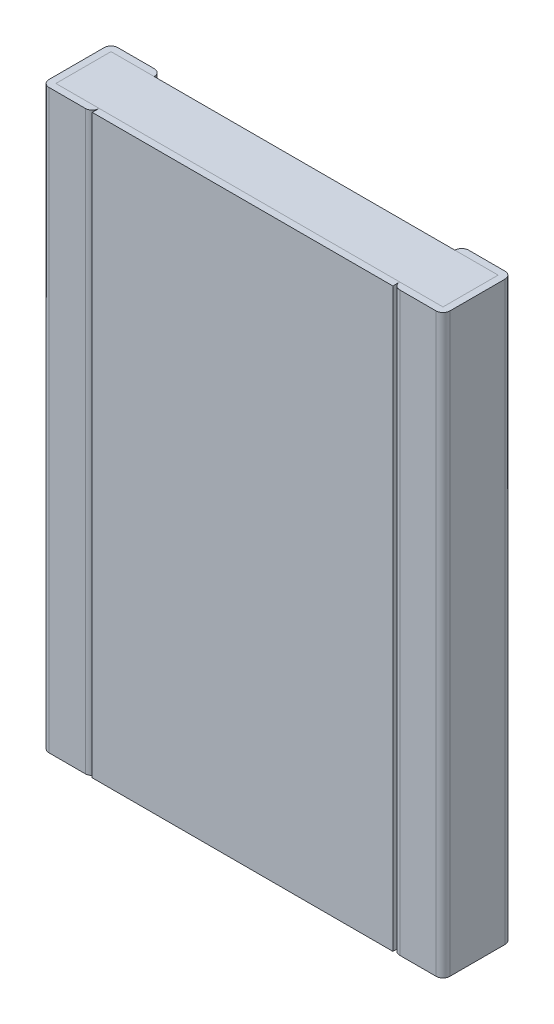
ISO-10303-21;
HEADER;
FILE_DESCRIPTION(('STEP AP214'),'2;1');
FILE_NAME('part.step','',(''),(''),'','','');
FILE_SCHEMA(('AUTOMOTIVE_DESIGN { 1 0 10303 214 1 1 1 1 }'));
ENDSEC;
DATA;
#1=APPLICATION_CONTEXT('core data for automotive mechanical design processes');
#2=APPLICATION_PROTOCOL_DEFINITION('international standard','automotive_design',2000,#1);
#3=PRODUCT_CONTEXT('',#1,'mechanical');
#4=PRODUCT('Part','Part','',(#3));
#5=PRODUCT_RELATED_PRODUCT_CATEGORY('part','',(#4));
#6=PRODUCT_DEFINITION_FORMATION('','',#4);
#7=PRODUCT_DEFINITION_CONTEXT('part definition',#1,'design');
#8=PRODUCT_DEFINITION('design','',#6,#7);
#9=PRODUCT_DEFINITION_SHAPE('','',#8);
#10=(LENGTH_UNIT() NAMED_UNIT(*) SI_UNIT(.MILLI.,.METRE.));
#11=(NAMED_UNIT(*) PLANE_ANGLE_UNIT() SI_UNIT($,.RADIAN.));
#12=(NAMED_UNIT(*) SI_UNIT($,.STERADIAN.) SOLID_ANGLE_UNIT());
#13=UNCERTAINTY_MEASURE_WITH_UNIT(LENGTH_MEASURE(1.E-05),#10,'distance_accuracy_value','');
#14=(GEOMETRIC_REPRESENTATION_CONTEXT(3) GLOBAL_UNCERTAINTY_ASSIGNED_CONTEXT((#13)) GLOBAL_UNIT_ASSIGNED_CONTEXT((#10,
#11,#12)) REPRESENTATION_CONTEXT('',''));
#15=CARTESIAN_POINT('',(0.,0.,0.));
#16=DIRECTION('',(0.,0.,1.));
#17=DIRECTION('',(1.,0.,0.));
#18=AXIS2_PLACEMENT_3D('',#15,#16,#17);
#19=CARTESIAN_POINT('',(-1.6,-2.3,0.));
#20=DIRECTION('',(1.,0.,0.));
#21=DIRECTION('',(0.,0.,1.));
#22=AXIS2_PLACEMENT_3D('',#19,#20,#21);
#23=PLANE('',#22);
#24=DIRECTION('',(0.,1.,0.));
#25=VECTOR('',#24,1.);
#26=CARTESIAN_POINT('',(-1.6,-2.3,0.495));
#27=LINE('',#26,#25);
#28=CARTESIAN_POINT('',(-1.6,-2.3,0.495));
#29=VERTEX_POINT('',#28);
#30=CARTESIAN_POINT('',(-1.6,2.3,0.495));
#31=VERTEX_POINT('',#30);
#32=EDGE_CURVE('E11',#29,#31,#27,.T.);
#33=ORIENTED_EDGE('',*,*,#32,.T.);
#34=DIRECTION('',(0.,0.,1.));
#35=VECTOR('',#34,1.);
#36=CARTESIAN_POINT('',(-1.6,2.3,0.));
#37=LINE('',#36,#35);
#38=CARTESIAN_POINT('',(-1.6,2.3,0.055));
#39=VERTEX_POINT('',#38);
#40=EDGE_CURVE('E24',#39,#31,#37,.T.);
#41=ORIENTED_EDGE('',*,*,#40,.F.);
#42=DIRECTION('',(0.,1.,0.));
#43=VECTOR('',#42,1.);
#44=CARTESIAN_POINT('',(-1.6,-2.3,0.055));
#45=LINE('',#44,#43);
#46=CARTESIAN_POINT('',(-1.6,-2.3,0.055));
#47=VERTEX_POINT('',#46);
#48=EDGE_CURVE('E347',#47,#39,#45,.T.);
#49=ORIENTED_EDGE('',*,*,#48,.F.);
#50=DIRECTION('',(0.,0.,1.));
#51=VECTOR('',#50,1.);
#52=CARTESIAN_POINT('',(-1.6,-2.3,0.));
#53=LINE('',#52,#51);
#54=EDGE_CURVE('E36',#47,#29,#53,.T.);
#55=ORIENTED_EDGE('',*,*,#54,.T.);
#56=EDGE_LOOP('',(#33,#41,#49,#55));
#57=FACE_BOUND('',#56,.T.);
#58=ADVANCED_FACE('F17',(#57),#23,.F.);
#59=CARTESIAN_POINT('',(-1.6,-2.3,0.));
#60=DIRECTION('',(0.,1.,0.));
#61=DIRECTION('',(0.,0.,1.));
#62=AXIS2_PLACEMENT_3D('',#59,#60,#61);
#63=PLANE('',#62);
#64=CARTESIAN_POINT('',(-1.255,-2.3,0.055));
#65=DIRECTION('',(0.,1.,0.));
#66=DIRECTION('',(0.,0.,1.));
#67=AXIS2_PLACEMENT_3D('',#64,#65,#66);
#68=CIRCLE('',#67,0.055);
#69=CARTESIAN_POINT('',(-1.2,-2.3,0.055));
#70=VERTEX_POINT('',#69);
#71=CARTESIAN_POINT('',(-1.255,-2.3,0.));
#72=VERTEX_POINT('',#71);
#73=EDGE_CURVE('E343',#70,#72,#68,.T.);
#74=ORIENTED_EDGE('',*,*,#73,.F.);
#75=DIRECTION('',(1.,0.,0.));
#76=VECTOR('',#75,1.);
#77=CARTESIAN_POINT('',(-1.545,-2.3,0.055));
#78=LINE('',#77,#76);
#79=CARTESIAN_POINT('',(-1.545,-2.3,0.055));
#80=VERTEX_POINT('',#79);
#81=EDGE_CURVE('E341',#80,#70,#78,.T.);
#82=ORIENTED_EDGE('',*,*,#81,.F.);
#83=DIRECTION('',(0.,0.,1.));
#84=VECTOR('',#83,1.);
#85=CARTESIAN_POINT('',(-1.545,-2.3,0.055));
#86=LINE('',#85,#84);
#87=CARTESIAN_POINT('',(-1.545,-2.3,0.495));
#88=VERTEX_POINT('',#87);
#89=EDGE_CURVE('E338',#80,#88,#86,.T.);
#90=ORIENTED_EDGE('',*,*,#89,.T.);
#91=DIRECTION('',(1.,0.,0.));
#92=VECTOR('',#91,1.);
#93=CARTESIAN_POINT('',(-1.545,-2.3,0.495));
#94=LINE('',#93,#92);
#95=CARTESIAN_POINT('',(-1.2,-2.3,0.495));
#96=VERTEX_POINT('',#95);
#97=EDGE_CURVE('E335',#88,#96,#94,.T.);
#98=ORIENTED_EDGE('',*,*,#97,.T.);
#99=CARTESIAN_POINT('',(-1.255,-2.3,0.495));
#100=DIRECTION('',(0.,-1.,0.));
#101=DIRECTION('',(0.,0.,1.));
#102=AXIS2_PLACEMENT_3D('',#99,#100,#101);
#103=CIRCLE('',#102,0.055);
#104=CARTESIAN_POINT('',(-1.255,-2.3,0.55));
#105=VERTEX_POINT('',#104);
#106=EDGE_CURVE('E332',#96,#105,#103,.T.);
#107=ORIENTED_EDGE('',*,*,#106,.T.);
#108=DIRECTION('',(1.,0.,0.));
#109=VECTOR('',#108,1.);
#110=CARTESIAN_POINT('',(-1.6,-2.3,0.55));
#111=LINE('',#110,#109);
#112=CARTESIAN_POINT('',(-1.545,-2.3,0.55));
#113=VERTEX_POINT('',#112);
#114=EDGE_CURVE('E330',#113,#105,#111,.T.);
#115=ORIENTED_EDGE('',*,*,#114,.F.);
#116=CARTESIAN_POINT('',(-1.545,-2.3,0.495));
#117=DIRECTION('',(0.,1.,0.));
#118=DIRECTION('',(0.,0.,1.));
#119=AXIS2_PLACEMENT_3D('',#116,#117,#118);
#120=CIRCLE('',#119,0.055);
#121=EDGE_CURVE('E328',#29,#113,#120,.T.);
#122=ORIENTED_EDGE('',*,*,#121,.F.);
#123=ORIENTED_EDGE('',*,*,#54,.F.);
#124=CARTESIAN_POINT('',(-1.545,-2.3,0.055));
#125=DIRECTION('',(0.,-1.,0.));
#126=DIRECTION('',(0.,0.,1.));
#127=AXIS2_PLACEMENT_3D('',#124,#125,#126);
#128=CIRCLE('',#127,0.055);
#129=CARTESIAN_POINT('',(-1.545,-2.3,0.));
#130=VERTEX_POINT('',#129);
#131=EDGE_CURVE('E325',#47,#130,#128,.T.);
#132=ORIENTED_EDGE('',*,*,#131,.T.);
#133=DIRECTION('',(1.,0.,0.));
#134=VECTOR('',#133,1.);
#135=CARTESIAN_POINT('',(-1.6,-2.3,0.));
#136=LINE('',#135,#134);
#137=EDGE_CURVE('E323',#130,#72,#136,.T.);
#138=ORIENTED_EDGE('',*,*,#137,.T.);
#139=EDGE_LOOP('',(#74,#82,#90,#98,#107,#115,#122,#123,#132,#138));
#140=FACE_BOUND('',#139,.T.);
#141=ADVANCED_FACE('F361',(#140),#63,.F.);
#142=CARTESIAN_POINT('',(-1.545,-2.3,0.055));
#143=DIRECTION('',(0.,1.,0.));
#144=DIRECTION('',(-1.,0.,0.));
#145=AXIS2_PLACEMENT_3D('',#142,#143,#144);
#146=CYLINDRICAL_SURFACE('',#145,0.055);
#147=ORIENTED_EDGE('',*,*,#48,.T.);
#148=CARTESIAN_POINT('',(-1.545,2.3,0.055));
#149=DIRECTION('',(0.,-1.,0.));
#150=DIRECTION('',(0.,0.,1.));
#151=AXIS2_PLACEMENT_3D('',#148,#149,#150);
#152=CIRCLE('',#151,0.055);
#153=CARTESIAN_POINT('',(-1.545,2.3,0.));
#154=VERTEX_POINT('',#153);
#155=EDGE_CURVE('E321',#39,#154,#152,.T.);
#156=ORIENTED_EDGE('',*,*,#155,.T.);
#157=DIRECTION('',(0.,1.,0.));
#158=VECTOR('',#157,1.);
#159=CARTESIAN_POINT('',(-1.545,-2.3,0.));
#160=LINE('',#159,#158);
#161=EDGE_CURVE('E318',#130,#154,#160,.T.);
#162=ORIENTED_EDGE('',*,*,#161,.F.);
#163=ORIENTED_EDGE('',*,*,#131,.F.);
#164=EDGE_LOOP('',(#147,#156,#162,#163));
#165=FACE_BOUND('',#164,.T.);
#166=ADVANCED_FACE('F350',(#165),#146,.T.);
#167=CARTESIAN_POINT('',(-1.545,-2.3,0.495));
#168=DIRECTION('',(0.,1.,0.));
#169=DIRECTION('',(-1.,0.,0.));
#170=AXIS2_PLACEMENT_3D('',#167,#168,#169);
#171=CYLINDRICAL_SURFACE('',#170,0.055);
#172=ORIENTED_EDGE('',*,*,#121,.T.);
#173=DIRECTION('',(0.,1.,0.));
#174=VECTOR('',#173,1.);
#175=CARTESIAN_POINT('',(-1.545,-2.3,0.55));
#176=LINE('',#175,#174);
#177=CARTESIAN_POINT('',(-1.545,2.3,0.55));
#178=VERTEX_POINT('',#177);
#179=EDGE_CURVE('E316',#113,#178,#176,.T.);
#180=ORIENTED_EDGE('',*,*,#179,.T.);
#181=CARTESIAN_POINT('',(-1.545,2.3,0.495));
#182=DIRECTION('',(0.,1.,0.));
#183=DIRECTION('',(0.,0.,1.));
#184=AXIS2_PLACEMENT_3D('',#181,#182,#183);
#185=CIRCLE('',#184,0.055);
#186=EDGE_CURVE('E314',#31,#178,#185,.T.);
#187=ORIENTED_EDGE('',*,*,#186,.F.);
#188=ORIENTED_EDGE('',*,*,#32,.F.);
#189=EDGE_LOOP('',(#172,#180,#187,#188));
#190=FACE_BOUND('',#189,.T.);
#191=ADVANCED_FACE('F366',(#190),#171,.T.);
#192=CARTESIAN_POINT('',(-1.6,2.3,0.));
#193=DIRECTION('',(0.,1.,0.));
#194=DIRECTION('',(0.,0.,1.));
#195=AXIS2_PLACEMENT_3D('',#192,#193,#194);
#196=PLANE('',#195);
#197=DIRECTION('',(1.,0.,0.));
#198=VECTOR('',#197,1.);
#199=CARTESIAN_POINT('',(-1.6,2.3,0.));
#200=LINE('',#199,#198);
#201=CARTESIAN_POINT('',(-1.255,2.3,0.));
#202=VERTEX_POINT('',#201);
#203=EDGE_CURVE('E312',#154,#202,#200,.T.);
#204=ORIENTED_EDGE('',*,*,#203,.F.);
#205=ORIENTED_EDGE('',*,*,#155,.F.);
#206=ORIENTED_EDGE('',*,*,#40,.T.);
#207=ORIENTED_EDGE('',*,*,#186,.T.);
#208=DIRECTION('',(1.,0.,0.));
#209=VECTOR('',#208,1.);
#210=CARTESIAN_POINT('',(-1.6,2.3,0.55));
#211=LINE('',#210,#209);
#212=CARTESIAN_POINT('',(-1.255,2.3,0.55));
#213=VERTEX_POINT('',#212);
#214=EDGE_CURVE('E310',#178,#213,#211,.T.);
#215=ORIENTED_EDGE('',*,*,#214,.T.);
#216=CARTESIAN_POINT('',(-1.255,2.3,0.495));
#217=DIRECTION('',(0.,-1.,0.));
#218=DIRECTION('',(0.,0.,1.));
#219=AXIS2_PLACEMENT_3D('',#216,#217,#218);
#220=CIRCLE('',#219,0.055);
#221=CARTESIAN_POINT('',(-1.2,2.3,0.495));
#222=VERTEX_POINT('',#221);
#223=EDGE_CURVE('E307',#222,#213,#220,.T.);
#224=ORIENTED_EDGE('',*,*,#223,.F.);
#225=DIRECTION('',(1.,0.,0.));
#226=VECTOR('',#225,1.);
#227=CARTESIAN_POINT('',(-1.545,2.3,0.495));
#228=LINE('',#227,#226);
#229=CARTESIAN_POINT('',(-1.545,2.3,0.495));
#230=VERTEX_POINT('',#229);
#231=EDGE_CURVE('E304',#230,#222,#228,.T.);
#232=ORIENTED_EDGE('',*,*,#231,.F.);
#233=DIRECTION('',(0.,0.,1.));
#234=VECTOR('',#233,1.);
#235=CARTESIAN_POINT('',(-1.545,2.3,0.055));
#236=LINE('',#235,#234);
#237=CARTESIAN_POINT('',(-1.545,2.3,0.055));
#238=VERTEX_POINT('',#237);
#239=EDGE_CURVE('E301',#238,#230,#236,.T.);
#240=ORIENTED_EDGE('',*,*,#239,.F.);
#241=DIRECTION('',(1.,0.,0.));
#242=VECTOR('',#241,1.);
#243=CARTESIAN_POINT('',(-1.545,2.3,0.055));
#244=LINE('',#243,#242);
#245=CARTESIAN_POINT('',(-1.2,2.3,0.055));
#246=VERTEX_POINT('',#245);
#247=EDGE_CURVE('E299',#238,#246,#244,.T.);
#248=ORIENTED_EDGE('',*,*,#247,.T.);
#249=CARTESIAN_POINT('',(-1.255,2.3,0.055));
#250=DIRECTION('',(0.,1.,0.));
#251=DIRECTION('',(0.,0.,1.));
#252=AXIS2_PLACEMENT_3D('',#249,#250,#251);
#253=CIRCLE('',#252,0.055);
#254=EDGE_CURVE('E296',#246,#202,#253,.T.);
#255=ORIENTED_EDGE('',*,*,#254,.T.);
#256=EDGE_LOOP('',(#204,#205,#206,#207,#215,#224,#232,#240,#248,#255));
#257=FACE_BOUND('',#256,.T.);
#258=ADVANCED_FACE('F354',(#257),#196,.T.);
#259=CARTESIAN_POINT('',(-1.6,-2.3,0.));
#260=DIRECTION('',(0.,0.,1.));
#261=DIRECTION('',(1.,0.,0.));
#262=AXIS2_PLACEMENT_3D('',#259,#260,#261);
#263=PLANE('',#262);
#264=DIRECTION('',(0.,1.,0.));
#265=VECTOR('',#264,1.);
#266=CARTESIAN_POINT('',(-1.255,-2.3,0.));
#267=LINE('',#266,#265);
#268=EDGE_CURVE('E293',#72,#202,#267,.T.);
#269=ORIENTED_EDGE('',*,*,#268,.F.);
#270=ORIENTED_EDGE('',*,*,#137,.F.);
#271=ORIENTED_EDGE('',*,*,#161,.T.);
#272=ORIENTED_EDGE('',*,*,#203,.T.);
#273=EDGE_LOOP('',(#269,#270,#271,#272));
#274=FACE_BOUND('',#273,.T.);
#275=ADVANCED_FACE('F358',(#274),#263,.F.);
#276=CARTESIAN_POINT('',(-1.255,-2.3,0.055));
#277=DIRECTION('',(0.,1.,0.));
#278=DIRECTION('',(1.,0.,0.));
#279=AXIS2_PLACEMENT_3D('',#276,#277,#278);
#280=CYLINDRICAL_SURFACE('',#279,0.055);
#281=ORIENTED_EDGE('',*,*,#73,.T.);
#282=ORIENTED_EDGE('',*,*,#268,.T.);
#283=ORIENTED_EDGE('',*,*,#254,.F.);
#284=DIRECTION('',(0.,1.,0.));
#285=VECTOR('',#284,1.);
#286=CARTESIAN_POINT('',(-1.2,-2.3,0.055));
#287=LINE('',#286,#285);
#288=EDGE_CURVE('E290',#70,#246,#287,.T.);
#289=ORIENTED_EDGE('',*,*,#288,.F.);
#290=EDGE_LOOP('',(#281,#282,#283,#289));
#291=FACE_BOUND('',#290,.T.);
#292=ADVANCED_FACE('F381',(#291),#280,.T.);
#293=CARTESIAN_POINT('',(-1.545,-2.3,0.055));
#294=DIRECTION('',(0.,1.,0.));
#295=DIRECTION('',(0.,0.,1.));
#296=AXIS2_PLACEMENT_3D('',#293,#294,#295);
#297=PLANE('',#296);
#298=DIRECTION('',(1.,0.,0.));
#299=VECTOR('',#298,1.);
#300=CARTESIAN_POINT('',(-1.545,-2.3,0.055));
#301=LINE('',#300,#299);
#302=CARTESIAN_POINT('',(1.2,-2.3,0.055));
#303=VERTEX_POINT('',#302);
#304=EDGE_CURVE('E287',#70,#303,#301,.T.);
#305=ORIENTED_EDGE('',*,*,#304,.T.);
#306=DIRECTION('',(1.,0.,0.));
#307=VECTOR('',#306,1.);
#308=CARTESIAN_POINT('',(-1.545,-2.3,0.055));
#309=LINE('',#308,#307);
#310=CARTESIAN_POINT('',(1.545,-2.3,0.055));
#311=VERTEX_POINT('',#310);
#312=EDGE_CURVE('E284',#303,#311,#309,.T.);
#313=ORIENTED_EDGE('',*,*,#312,.T.);
#314=DIRECTION('',(0.,0.,1.));
#315=VECTOR('',#314,1.);
#316=CARTESIAN_POINT('',(1.545,-2.3,0.055));
#317=LINE('',#316,#315);
#318=CARTESIAN_POINT('',(1.545,-2.3,0.495));
#319=VERTEX_POINT('',#318);
#320=EDGE_CURVE('E281',#311,#319,#317,.T.);
#321=ORIENTED_EDGE('',*,*,#320,.T.);
#322=DIRECTION('',(1.,0.,0.));
#323=VECTOR('',#322,1.);
#324=CARTESIAN_POINT('',(-1.545,-2.3,0.495));
#325=LINE('',#324,#323);
#326=CARTESIAN_POINT('',(1.2,-2.3,0.495));
#327=VERTEX_POINT('',#326);
#328=EDGE_CURVE('E279',#327,#319,#325,.T.);
#329=ORIENTED_EDGE('',*,*,#328,.F.);
#330=DIRECTION('',(1.,0.,0.));
#331=VECTOR('',#330,1.);
#332=CARTESIAN_POINT('',(-1.2,-2.3,0.495));
#333=LINE('',#332,#331);
#334=EDGE_CURVE('E277',#96,#327,#333,.T.);
#335=ORIENTED_EDGE('',*,*,#334,.F.);
#336=ORIENTED_EDGE('',*,*,#97,.F.);
#337=ORIENTED_EDGE('',*,*,#89,.F.);
#338=ORIENTED_EDGE('',*,*,#81,.T.);
#339=EDGE_LOOP('',(#305,#313,#321,#329,#335,#336,#337,#338));
#340=FACE_BOUND('',#339,.T.);
#341=ADVANCED_FACE('F400',(#340),#297,.F.);
#342=CARTESIAN_POINT('',(-1.6,-2.3,0.55));
#343=DIRECTION('',(0.,0.,1.));
#344=DIRECTION('',(1.,0.,0.));
#345=AXIS2_PLACEMENT_3D('',#342,#343,#344);
#346=PLANE('',#345);
#347=ORIENTED_EDGE('',*,*,#214,.F.);
#348=ORIENTED_EDGE('',*,*,#179,.F.);
#349=ORIENTED_EDGE('',*,*,#114,.T.);
#350=DIRECTION('',(0.,1.,0.));
#351=VECTOR('',#350,1.);
#352=CARTESIAN_POINT('',(-1.255,-2.3,0.55));
#353=LINE('',#352,#351);
#354=EDGE_CURVE('E274',#105,#213,#353,.T.);
#355=ORIENTED_EDGE('',*,*,#354,.T.);
#356=EDGE_LOOP('',(#347,#348,#349,#355));
#357=FACE_BOUND('',#356,.T.);
#358=ADVANCED_FACE('F369',(#357),#346,.T.);
#359=CARTESIAN_POINT('',(-1.255,-2.3,0.495));
#360=DIRECTION('',(0.,1.,0.));
#361=DIRECTION('',(1.,0.,0.));
#362=AXIS2_PLACEMENT_3D('',#359,#360,#361);
#363=CYLINDRICAL_SURFACE('',#362,0.055);
#364=DIRECTION('',(0.,1.,0.));
#365=VECTOR('',#364,1.);
#366=CARTESIAN_POINT('',(-1.2,-2.3,0.495));
#367=LINE('',#366,#365);
#368=EDGE_CURVE('E271',#96,#222,#367,.T.);
#369=ORIENTED_EDGE('',*,*,#368,.T.);
#370=ORIENTED_EDGE('',*,*,#223,.T.);
#371=ORIENTED_EDGE('',*,*,#354,.F.);
#372=ORIENTED_EDGE('',*,*,#106,.F.);
#373=EDGE_LOOP('',(#369,#370,#371,#372));
#374=FACE_BOUND('',#373,.T.);
#375=ADVANCED_FACE('F372',(#374),#363,.T.);
#376=CARTESIAN_POINT('',(-1.545,2.3,0.055));
#377=DIRECTION('',(0.,1.,0.));
#378=DIRECTION('',(0.,0.,1.));
#379=AXIS2_PLACEMENT_3D('',#376,#377,#378);
#380=PLANE('',#379);
#381=ORIENTED_EDGE('',*,*,#247,.F.);
#382=ORIENTED_EDGE('',*,*,#239,.T.);
#383=ORIENTED_EDGE('',*,*,#231,.T.);
#384=DIRECTION('',(1.,0.,0.));
#385=VECTOR('',#384,1.);
#386=CARTESIAN_POINT('',(-1.2,2.3,0.495));
#387=LINE('',#386,#385);
#388=CARTESIAN_POINT('',(1.2,2.3,0.495));
#389=VERTEX_POINT('',#388);
#390=EDGE_CURVE('E269',#222,#389,#387,.T.);
#391=ORIENTED_EDGE('',*,*,#390,.T.);
#392=DIRECTION('',(1.,0.,0.));
#393=VECTOR('',#392,1.);
#394=CARTESIAN_POINT('',(-1.545,2.3,0.495));
#395=LINE('',#394,#393);
#396=CARTESIAN_POINT('',(1.545,2.3,0.495));
#397=VERTEX_POINT('',#396);
#398=EDGE_CURVE('E267',#389,#397,#395,.T.);
#399=ORIENTED_EDGE('',*,*,#398,.T.);
#400=DIRECTION('',(0.,0.,1.));
#401=VECTOR('',#400,1.);
#402=CARTESIAN_POINT('',(1.545,2.3,0.055));
#403=LINE('',#402,#401);
#404=CARTESIAN_POINT('',(1.545,2.3,0.055));
#405=VERTEX_POINT('',#404);
#406=EDGE_CURVE('E264',#405,#397,#403,.T.);
#407=ORIENTED_EDGE('',*,*,#406,.F.);
#408=DIRECTION('',(1.,0.,0.));
#409=VECTOR('',#408,1.);
#410=CARTESIAN_POINT('',(-1.545,2.3,0.055));
#411=LINE('',#410,#409);
#412=CARTESIAN_POINT('',(1.2,2.3,0.055));
#413=VERTEX_POINT('',#412);
#414=EDGE_CURVE('E261',#413,#405,#411,.T.);
#415=ORIENTED_EDGE('',*,*,#414,.F.);
#416=DIRECTION('',(1.,0.,0.));
#417=VECTOR('',#416,1.);
#418=CARTESIAN_POINT('',(-1.545,2.3,0.055));
#419=LINE('',#418,#417);
#420=EDGE_CURVE('E258',#246,#413,#419,.T.);
#421=ORIENTED_EDGE('',*,*,#420,.F.);
#422=EDGE_LOOP('',(#381,#382,#383,#391,#399,#407,#415,#421));
#423=FACE_BOUND('',#422,.T.);
#424=ADVANCED_FACE('F376',(#423),#380,.T.);
#425=CARTESIAN_POINT('',(-1.545,-2.3,0.055));
#426=DIRECTION('',(0.,0.,1.));
#427=DIRECTION('',(1.,0.,0.));
#428=AXIS2_PLACEMENT_3D('',#425,#426,#427);
#429=PLANE('',#428);
#430=ORIENTED_EDGE('',*,*,#420,.T.);
#431=DIRECTION('',(0.,1.,0.));
#432=VECTOR('',#431,1.);
#433=CARTESIAN_POINT('',(1.2,-2.3,0.055));
#434=LINE('',#433,#432);
#435=EDGE_CURVE('E255',#303,#413,#434,.T.);
#436=ORIENTED_EDGE('',*,*,#435,.F.);
#437=ORIENTED_EDGE('',*,*,#304,.F.);
#438=ORIENTED_EDGE('',*,*,#288,.T.);
#439=EDGE_LOOP('',(#430,#436,#437,#438));
#440=FACE_BOUND('',#439,.T.);
#441=ADVANCED_FACE('F384',(#440),#429,.F.);
#442=CARTESIAN_POINT('',(1.2,-2.3,0.));
#443=DIRECTION('',(0.,1.,0.));
#444=DIRECTION('',(0.,0.,1.));
#445=AXIS2_PLACEMENT_3D('',#442,#443,#444);
#446=PLANE('',#445);
#447=CARTESIAN_POINT('',(1.545,-2.3,0.055));
#448=DIRECTION('',(0.,1.,0.));
#449=DIRECTION('',(0.,0.,1.));
#450=AXIS2_PLACEMENT_3D('',#447,#448,#449);
#451=CIRCLE('',#450,0.055);
#452=CARTESIAN_POINT('',(1.6,-2.3,0.055));
#453=VERTEX_POINT('',#452);
#454=CARTESIAN_POINT('',(1.545,-2.3,0.));
#455=VERTEX_POINT('',#454);
#456=EDGE_CURVE('E252',#453,#455,#451,.T.);
#457=ORIENTED_EDGE('',*,*,#456,.F.);
#458=DIRECTION('',(0.,0.,1.));
#459=VECTOR('',#458,1.);
#460=CARTESIAN_POINT('',(1.6,-2.3,0.));
#461=LINE('',#460,#459);
#462=CARTESIAN_POINT('',(1.6,-2.3,0.495));
#463=VERTEX_POINT('',#462);
#464=EDGE_CURVE('E249',#453,#463,#461,.T.);
#465=ORIENTED_EDGE('',*,*,#464,.T.);
#466=CARTESIAN_POINT('',(1.545,-2.3,0.495));
#467=DIRECTION('',(0.,-1.,0.));
#468=DIRECTION('',(0.,0.,1.));
#469=AXIS2_PLACEMENT_3D('',#466,#467,#468);
#470=CIRCLE('',#469,0.055);
#471=CARTESIAN_POINT('',(1.545,-2.3,0.55));
#472=VERTEX_POINT('',#471);
#473=EDGE_CURVE('E246',#463,#472,#470,.T.);
#474=ORIENTED_EDGE('',*,*,#473,.T.);
#475=DIRECTION('',(1.,0.,0.));
#476=VECTOR('',#475,1.);
#477=CARTESIAN_POINT('',(1.2,-2.3,0.55));
#478=LINE('',#477,#476);
#479=CARTESIAN_POINT('',(1.255,-2.3,0.55));
#480=VERTEX_POINT('',#479);
#481=EDGE_CURVE('E244',#480,#472,#478,.T.);
#482=ORIENTED_EDGE('',*,*,#481,.F.);
#483=CARTESIAN_POINT('',(1.255,-2.3,0.495));
#484=DIRECTION('',(0.,1.,0.));
#485=DIRECTION('',(0.,0.,1.));
#486=AXIS2_PLACEMENT_3D('',#483,#484,#485);
#487=CIRCLE('',#486,0.055);
#488=EDGE_CURVE('E242',#327,#480,#487,.T.);
#489=ORIENTED_EDGE('',*,*,#488,.F.);
#490=ORIENTED_EDGE('',*,*,#328,.T.);
#491=ORIENTED_EDGE('',*,*,#320,.F.);
#492=ORIENTED_EDGE('',*,*,#312,.F.);
#493=CARTESIAN_POINT('',(1.255,-2.3,0.055));
#494=DIRECTION('',(0.,-1.,0.));
#495=DIRECTION('',(0.,0.,1.));
#496=AXIS2_PLACEMENT_3D('',#493,#494,#495);
#497=CIRCLE('',#496,0.055);
#498=CARTESIAN_POINT('',(1.255,-2.3,0.));
#499=VERTEX_POINT('',#498);
#500=EDGE_CURVE('E239',#303,#499,#497,.T.);
#501=ORIENTED_EDGE('',*,*,#500,.T.);
#502=DIRECTION('',(1.,0.,0.));
#503=VECTOR('',#502,1.);
#504=CARTESIAN_POINT('',(1.2,-2.3,0.));
#505=LINE('',#504,#503);
#506=EDGE_CURVE('E237',#499,#455,#505,.T.);
#507=ORIENTED_EDGE('',*,*,#506,.T.);
#508=EDGE_LOOP('',(#457,#465,#474,#482,#489,#490,#491,#492,#501,#507));
#509=FACE_BOUND('',#508,.T.);
#510=ADVANCED_FACE('F398',(#509),#446,.F.);
#511=CARTESIAN_POINT('',(-1.2,-2.3,0.495));
#512=DIRECTION('',(0.,1.,0.));
#513=DIRECTION('',(0.,0.,1.));
#514=AXIS2_PLACEMENT_3D('',#511,#512,#513);
#515=PLANE('',#514);
#516=DIRECTION('',(0.,0.,1.));
#517=VECTOR('',#516,1.);
#518=CARTESIAN_POINT('',(1.2,-2.3,0.495));
#519=LINE('',#518,#517);
#520=CARTESIAN_POINT('',(1.2,-2.3,0.55));
#521=VERTEX_POINT('',#520);
#522=EDGE_CURVE('E235',#327,#521,#519,.T.);
#523=ORIENTED_EDGE('',*,*,#522,.T.);
#524=DIRECTION('',(1.,0.,0.));
#525=VECTOR('',#524,1.);
#526=CARTESIAN_POINT('',(-1.2,-2.3,0.55));
#527=LINE('',#526,#525);
#528=CARTESIAN_POINT('',(-1.2,-2.3,0.55));
#529=VERTEX_POINT('',#528);
#530=EDGE_CURVE('E190',#529,#521,#527,.T.);
#531=ORIENTED_EDGE('',*,*,#530,.F.);
#532=DIRECTION('',(0.,0.,1.));
#533=VECTOR('',#532,1.);
#534=CARTESIAN_POINT('',(-1.2,-2.3,0.495));
#535=LINE('',#534,#533);
#536=EDGE_CURVE('E232',#96,#529,#535,.T.);
#537=ORIENTED_EDGE('',*,*,#536,.F.);
#538=ORIENTED_EDGE('',*,*,#334,.T.);
#539=EDGE_LOOP('',(#523,#531,#537,#538));
#540=FACE_BOUND('',#539,.T.);
#541=ADVANCED_FACE('F409',(#540),#515,.F.);
#542=CARTESIAN_POINT('',(-1.2,-2.3,0.495));
#543=DIRECTION('',(1.,0.,0.));
#544=DIRECTION('',(0.,0.,1.));
#545=AXIS2_PLACEMENT_3D('',#542,#543,#544);
#546=PLANE('',#545);
#547=DIRECTION('',(0.,1.,0.));
#548=VECTOR('',#547,1.);
#549=CARTESIAN_POINT('',(-1.2,-2.3,0.55));
#550=LINE('',#549,#548);
#551=CARTESIAN_POINT('',(-1.2,2.3,0.55));
#552=VERTEX_POINT('',#551);
#553=EDGE_CURVE('E230',#529,#552,#550,.T.);
#554=ORIENTED_EDGE('',*,*,#553,.T.);
#555=DIRECTION('',(0.,0.,1.));
#556=VECTOR('',#555,1.);
#557=CARTESIAN_POINT('',(-1.2,2.3,0.495));
#558=LINE('',#557,#556);
#559=EDGE_CURVE('E172',#222,#552,#558,.T.);
#560=ORIENTED_EDGE('',*,*,#559,.F.);
#561=ORIENTED_EDGE('',*,*,#368,.F.);
#562=ORIENTED_EDGE('',*,*,#536,.T.);
#563=EDGE_LOOP('',(#554,#560,#561,#562));
#564=FACE_BOUND('',#563,.T.);
#565=ADVANCED_FACE('F408',(#564),#546,.F.);
#566=CARTESIAN_POINT('',(1.2,2.3,0.));
#567=DIRECTION('',(0.,1.,0.));
#568=DIRECTION('',(0.,0.,1.));
#569=AXIS2_PLACEMENT_3D('',#566,#567,#568);
#570=PLANE('',#569);
#571=DIRECTION('',(1.,0.,0.));
#572=VECTOR('',#571,1.);
#573=CARTESIAN_POINT('',(1.2,2.3,0.));
#574=LINE('',#573,#572);
#575=CARTESIAN_POINT('',(1.255,2.3,0.));
#576=VERTEX_POINT('',#575);
#577=CARTESIAN_POINT('',(1.545,2.3,0.));
#578=VERTEX_POINT('',#577);
#579=EDGE_CURVE('E227',#576,#578,#574,.T.);
#580=ORIENTED_EDGE('',*,*,#579,.F.);
#581=CARTESIAN_POINT('',(1.255,2.3,0.055));
#582=DIRECTION('',(0.,-1.,0.));
#583=DIRECTION('',(0.,0.,1.));
#584=AXIS2_PLACEMENT_3D('',#581,#582,#583);
#585=CIRCLE('',#584,0.055);
#586=EDGE_CURVE('E224',#413,#576,#585,.T.);
#587=ORIENTED_EDGE('',*,*,#586,.F.);
#588=ORIENTED_EDGE('',*,*,#414,.T.);
#589=ORIENTED_EDGE('',*,*,#406,.T.);
#590=ORIENTED_EDGE('',*,*,#398,.F.);
#591=CARTESIAN_POINT('',(1.255,2.3,0.495));
#592=DIRECTION('',(0.,1.,0.));
#593=DIRECTION('',(0.,0.,1.));
#594=AXIS2_PLACEMENT_3D('',#591,#592,#593);
#595=CIRCLE('',#594,0.055);
#596=CARTESIAN_POINT('',(1.255,2.3,0.55));
#597=VERTEX_POINT('',#596);
#598=EDGE_CURVE('E222',#389,#597,#595,.T.);
#599=ORIENTED_EDGE('',*,*,#598,.T.);
#600=DIRECTION('',(1.,0.,0.));
#601=VECTOR('',#600,1.);
#602=CARTESIAN_POINT('',(1.2,2.3,0.55));
#603=LINE('',#602,#601);
#604=CARTESIAN_POINT('',(1.545,2.3,0.55));
#605=VERTEX_POINT('',#604);
#606=EDGE_CURVE('E220',#597,#605,#603,.T.);
#607=ORIENTED_EDGE('',*,*,#606,.T.);
#608=CARTESIAN_POINT('',(1.545,2.3,0.495));
#609=DIRECTION('',(0.,-1.,0.));
#610=DIRECTION('',(0.,0.,1.));
#611=AXIS2_PLACEMENT_3D('',#608,#609,#610);
#612=CIRCLE('',#611,0.055);
#613=CARTESIAN_POINT('',(1.6,2.3,0.495));
#614=VERTEX_POINT('',#613);
#615=EDGE_CURVE('E217',#614,#605,#612,.T.);
#616=ORIENTED_EDGE('',*,*,#615,.F.);
#617=DIRECTION('',(0.,0.,1.));
#618=VECTOR('',#617,1.);
#619=CARTESIAN_POINT('',(1.6,2.3,0.));
#620=LINE('',#619,#618);
#621=CARTESIAN_POINT('',(1.6,2.3,0.055));
#622=VERTEX_POINT('',#621);
#623=EDGE_CURVE('E214',#622,#614,#620,.T.);
#624=ORIENTED_EDGE('',*,*,#623,.F.);
#625=CARTESIAN_POINT('',(1.545,2.3,0.055));
#626=DIRECTION('',(0.,1.,0.));
#627=DIRECTION('',(0.,0.,1.));
#628=AXIS2_PLACEMENT_3D('',#625,#626,#627);
#629=CIRCLE('',#628,0.055);
#630=EDGE_CURVE('E177',#622,#578,#629,.T.);
#631=ORIENTED_EDGE('',*,*,#630,.T.);
#632=EDGE_LOOP('',(#580,#587,#588,#589,#590,#599,#607,#616,#624,#631));
#633=FACE_BOUND('',#632,.T.);
#634=ADVANCED_FACE('F388',(#633),#570,.T.);
#635=CARTESIAN_POINT('',(-1.2,2.3,0.495));
#636=DIRECTION('',(0.,1.,0.));
#637=DIRECTION('',(0.,0.,1.));
#638=AXIS2_PLACEMENT_3D('',#635,#636,#637);
#639=PLANE('',#638);
#640=ORIENTED_EDGE('',*,*,#390,.F.);
#641=ORIENTED_EDGE('',*,*,#559,.T.);
#642=DIRECTION('',(1.,0.,0.));
#643=VECTOR('',#642,1.);
#644=CARTESIAN_POINT('',(-1.2,2.3,0.55));
#645=LINE('',#644,#643);
#646=CARTESIAN_POINT('',(1.2,2.3,0.55));
#647=VERTEX_POINT('',#646);
#648=EDGE_CURVE('E165',#552,#647,#645,.T.);
#649=ORIENTED_EDGE('',*,*,#648,.T.);
#650=DIRECTION('',(0.,0.,1.));
#651=VECTOR('',#650,1.);
#652=CARTESIAN_POINT('',(1.2,2.3,0.495));
#653=LINE('',#652,#651);
#654=EDGE_CURVE('E169',#389,#647,#653,.T.);
#655=ORIENTED_EDGE('',*,*,#654,.F.);
#656=EDGE_LOOP('',(#640,#641,#649,#655));
#657=FACE_BOUND('',#656,.T.);
#658=ADVANCED_FACE('F168',(#657),#639,.T.);
#659=CARTESIAN_POINT('',(1.255,-2.3,0.055));
#660=DIRECTION('',(0.,1.,0.));
#661=DIRECTION('',(-1.,0.,0.));
#662=AXIS2_PLACEMENT_3D('',#659,#660,#661);
#663=CYLINDRICAL_SURFACE('',#662,0.055);
#664=ORIENTED_EDGE('',*,*,#435,.T.);
#665=ORIENTED_EDGE('',*,*,#586,.T.);
#666=DIRECTION('',(0.,1.,0.));
#667=VECTOR('',#666,1.);
#668=CARTESIAN_POINT('',(1.255,-2.3,0.));
#669=LINE('',#668,#667);
#670=EDGE_CURVE('E186',#499,#576,#669,.T.);
#671=ORIENTED_EDGE('',*,*,#670,.F.);
#672=ORIENTED_EDGE('',*,*,#500,.F.);
#673=EDGE_LOOP('',(#664,#665,#671,#672));
#674=FACE_BOUND('',#673,.T.);
#675=ADVANCED_FACE('F391',(#674),#663,.T.);
#676=CARTESIAN_POINT('',(1.2,-2.3,0.));
#677=DIRECTION('',(0.,0.,1.));
#678=DIRECTION('',(1.,0.,0.));
#679=AXIS2_PLACEMENT_3D('',#676,#677,#678);
#680=PLANE('',#679);
#681=DIRECTION('',(0.,1.,0.));
#682=VECTOR('',#681,1.);
#683=CARTESIAN_POINT('',(1.545,-2.3,0.));
#684=LINE('',#683,#682);
#685=EDGE_CURVE('E207',#455,#578,#684,.T.);
#686=ORIENTED_EDGE('',*,*,#685,.F.);
#687=ORIENTED_EDGE('',*,*,#506,.F.);
#688=ORIENTED_EDGE('',*,*,#670,.T.);
#689=ORIENTED_EDGE('',*,*,#579,.T.);
#690=EDGE_LOOP('',(#686,#687,#688,#689));
#691=FACE_BOUND('',#690,.T.);
#692=ADVANCED_FACE('F395',(#691),#680,.F.);
#693=CARTESIAN_POINT('',(1.545,-2.3,0.055));
#694=DIRECTION('',(0.,1.,0.));
#695=DIRECTION('',(1.,0.,0.));
#696=AXIS2_PLACEMENT_3D('',#693,#694,#695);
#697=CYLINDRICAL_SURFACE('',#696,0.055);
#698=ORIENTED_EDGE('',*,*,#456,.T.);
#699=ORIENTED_EDGE('',*,*,#685,.T.);
#700=ORIENTED_EDGE('',*,*,#630,.F.);
#701=DIRECTION('',(0.,1.,0.));
#702=VECTOR('',#701,1.);
#703=CARTESIAN_POINT('',(1.6,-2.3,0.055));
#704=LINE('',#703,#702);
#705=EDGE_CURVE('E204',#453,#622,#704,.T.);
#706=ORIENTED_EDGE('',*,*,#705,.F.);
#707=EDGE_LOOP('',(#698,#699,#700,#706));
#708=FACE_BOUND('',#707,.T.);
#709=ADVANCED_FACE('F427',(#708),#697,.T.);
#710=CARTESIAN_POINT('',(1.6,-2.3,0.));
#711=DIRECTION('',(1.,0.,0.));
#712=DIRECTION('',(0.,0.,1.));
#713=AXIS2_PLACEMENT_3D('',#710,#711,#712);
#714=PLANE('',#713);
#715=ORIENTED_EDGE('',*,*,#464,.F.);
#716=ORIENTED_EDGE('',*,*,#705,.T.);
#717=ORIENTED_EDGE('',*,*,#623,.T.);
#718=DIRECTION('',(0.,1.,0.));
#719=VECTOR('',#718,1.);
#720=CARTESIAN_POINT('',(1.6,-2.3,0.495));
#721=LINE('',#720,#719);
#722=EDGE_CURVE('E201',#463,#614,#721,.T.);
#723=ORIENTED_EDGE('',*,*,#722,.F.);
#724=EDGE_LOOP('',(#715,#716,#717,#723));
#725=FACE_BOUND('',#724,.T.);
#726=ADVANCED_FACE('F424',(#725),#714,.T.);
#727=CARTESIAN_POINT('',(1.545,-2.3,0.495));
#728=DIRECTION('',(0.,1.,0.));
#729=DIRECTION('',(1.,0.,0.));
#730=AXIS2_PLACEMENT_3D('',#727,#728,#729);
#731=CYLINDRICAL_SURFACE('',#730,0.055);
#732=ORIENTED_EDGE('',*,*,#722,.T.);
#733=ORIENTED_EDGE('',*,*,#615,.T.);
#734=DIRECTION('',(0.,1.,0.));
#735=VECTOR('',#734,1.);
#736=CARTESIAN_POINT('',(1.545,-2.3,0.55));
#737=LINE('',#736,#735);
#738=EDGE_CURVE('E198',#472,#605,#737,.T.);
#739=ORIENTED_EDGE('',*,*,#738,.F.);
#740=ORIENTED_EDGE('',*,*,#473,.F.);
#741=EDGE_LOOP('',(#732,#733,#739,#740));
#742=FACE_BOUND('',#741,.T.);
#743=ADVANCED_FACE('F420',(#742),#731,.T.);
#744=CARTESIAN_POINT('',(1.2,-2.3,0.55));
#745=DIRECTION('',(0.,0.,1.));
#746=DIRECTION('',(1.,0.,0.));
#747=AXIS2_PLACEMENT_3D('',#744,#745,#746);
#748=PLANE('',#747);
#749=ORIENTED_EDGE('',*,*,#606,.F.);
#750=DIRECTION('',(0.,1.,0.));
#751=VECTOR('',#750,1.);
#752=CARTESIAN_POINT('',(1.255,-2.3,0.55));
#753=LINE('',#752,#751);
#754=EDGE_CURVE('E193',#480,#597,#753,.T.);
#755=ORIENTED_EDGE('',*,*,#754,.F.);
#756=ORIENTED_EDGE('',*,*,#481,.T.);
#757=ORIENTED_EDGE('',*,*,#738,.T.);
#758=EDGE_LOOP('',(#749,#755,#756,#757));
#759=FACE_BOUND('',#758,.T.);
#760=ADVANCED_FACE('F417',(#759),#748,.T.);
#761=CARTESIAN_POINT('',(1.255,-2.3,0.495));
#762=DIRECTION('',(0.,1.,0.));
#763=DIRECTION('',(-1.,0.,0.));
#764=AXIS2_PLACEMENT_3D('',#761,#762,#763);
#765=CYLINDRICAL_SURFACE('',#764,0.055);
#766=ORIENTED_EDGE('',*,*,#488,.T.);
#767=ORIENTED_EDGE('',*,*,#754,.T.);
#768=ORIENTED_EDGE('',*,*,#598,.F.);
#769=DIRECTION('',(0.,1.,0.));
#770=VECTOR('',#769,1.);
#771=CARTESIAN_POINT('',(1.2,-2.3,0.495));
#772=LINE('',#771,#770);
#773=EDGE_CURVE('E185',#327,#389,#772,.T.);
#774=ORIENTED_EDGE('',*,*,#773,.F.);
#775=EDGE_LOOP('',(#766,#767,#768,#774));
#776=FACE_BOUND('',#775,.T.);
#777=ADVANCED_FACE('F412',(#776),#765,.T.);
#778=CARTESIAN_POINT('',(1.2,-2.3,0.495));
#779=DIRECTION('',(1.,0.,0.));
#780=DIRECTION('',(0.,0.,1.));
#781=AXIS2_PLACEMENT_3D('',#778,#779,#780);
#782=PLANE('',#781);
#783=ORIENTED_EDGE('',*,*,#522,.F.);
#784=ORIENTED_EDGE('',*,*,#773,.T.);
#785=ORIENTED_EDGE('',*,*,#654,.T.);
#786=DIRECTION('',(0.,1.,0.));
#787=VECTOR('',#786,1.);
#788=CARTESIAN_POINT('',(1.2,-2.3,0.55));
#789=LINE('',#788,#787);
#790=EDGE_CURVE('E183',#521,#647,#789,.T.);
#791=ORIENTED_EDGE('',*,*,#790,.F.);
#792=EDGE_LOOP('',(#783,#784,#785,#791));
#793=FACE_BOUND('',#792,.T.);
#794=ADVANCED_FACE('F182',(#793),#782,.T.);
#795=CARTESIAN_POINT('',(-1.2,-2.3,0.55));
#796=DIRECTION('',(0.,0.,1.));
#797=DIRECTION('',(1.,0.,0.));
#798=AXIS2_PLACEMENT_3D('',#795,#796,#797);
#799=PLANE('',#798);
#800=ORIENTED_EDGE('',*,*,#553,.F.);
#801=ORIENTED_EDGE('',*,*,#530,.T.);
#802=ORIENTED_EDGE('',*,*,#790,.T.);
#803=ORIENTED_EDGE('',*,*,#648,.F.);
#804=EDGE_LOOP('',(#800,#801,#802,#803));
#805=FACE_BOUND('',#804,.T.);
#806=ADVANCED_FACE('F188',(#805),#799,.T.);
#807=CLOSED_SHELL('',(#58,#141,#166,#191,#258,#275,#292,#341,#358,#375,#424,#441,#510,#541,#565,
#634,#658,#675,#692,#709,#726,#743,#760,#777,#794,#806));
#808=MANIFOLD_SOLID_BREP('B1',#807);
#809=ADVANCED_BREP_SHAPE_REPRESENTATION('',(#18,#808),#14);
#810=SHAPE_DEFINITION_REPRESENTATION(#9,#809);
ENDSEC;
END-ISO-10303-21;
